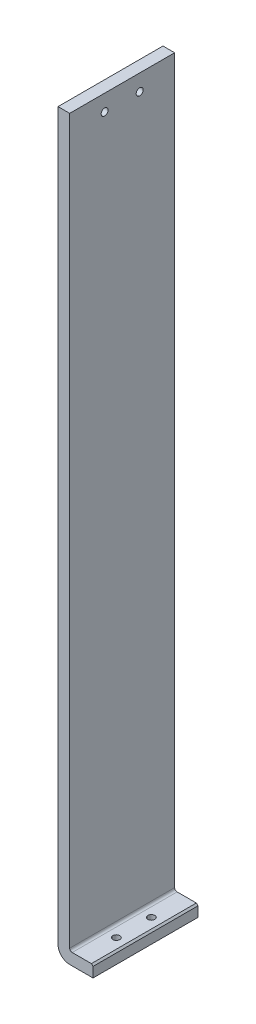
ISO-10303-21;
HEADER;
FILE_DESCRIPTION(('STEP AP214'),'2;1');
FILE_NAME('part.step','',(''),(''),'','','');
FILE_SCHEMA(('AUTOMOTIVE_DESIGN { 1 0 10303 214 1 1 1 1 }'));
ENDSEC;
DATA;
#1=APPLICATION_CONTEXT('core data for automotive mechanical design processes');
#2=APPLICATION_PROTOCOL_DEFINITION('international standard','automotive_design',2000,#1);
#3=PRODUCT_CONTEXT('',#1,'mechanical');
#4=PRODUCT('Part','Part','',(#3));
#5=PRODUCT_RELATED_PRODUCT_CATEGORY('part','',(#4));
#6=PRODUCT_DEFINITION_FORMATION('','',#4);
#7=PRODUCT_DEFINITION_CONTEXT('part definition',#1,'design');
#8=PRODUCT_DEFINITION('design','',#6,#7);
#9=PRODUCT_DEFINITION_SHAPE('','',#8);
#10=(LENGTH_UNIT() NAMED_UNIT(*) SI_UNIT(.MILLI.,.METRE.));
#11=(NAMED_UNIT(*) PLANE_ANGLE_UNIT() SI_UNIT($,.RADIAN.));
#12=(NAMED_UNIT(*) SI_UNIT($,.STERADIAN.) SOLID_ANGLE_UNIT());
#13=UNCERTAINTY_MEASURE_WITH_UNIT(LENGTH_MEASURE(1.E-05),#10,'distance_accuracy_value','');
#14=(GEOMETRIC_REPRESENTATION_CONTEXT(3) GLOBAL_UNCERTAINTY_ASSIGNED_CONTEXT((#13)) GLOBAL_UNIT_ASSIGNED_CONTEXT((#10,
#11,#12)) REPRESENTATION_CONTEXT('',''));
#15=CARTESIAN_POINT('',(0.,0.,0.));
#16=DIRECTION('',(0.,0.,1.));
#17=DIRECTION('',(1.,0.,0.));
#18=AXIS2_PLACEMENT_3D('',#15,#16,#17);
#19=CARTESIAN_POINT('',(2.49999999999952,-157.499999999971,45.));
#20=DIRECTION('',(-1.,0.,0.));
#21=DIRECTION('',(0.,-1.,0.));
#22=AXIS2_PLACEMENT_3D('',#19,#20,#21);
#23=PLANE('',#22);
#24=CARTESIAN_POINT('',(2.49999999999952,145.500000000029,15.));
#25=DIRECTION('',(-1.,0.,0.));
#26=DIRECTION('',(0.,-1.,0.));
#27=AXIS2_PLACEMENT_3D('',#24,#25,#26);
#28=CIRCLE('',#27,1.5);
#29=CARTESIAN_POINT('',(2.49999999999953,145.500000000029,16.5));
#30=VERTEX_POINT('',#29);
#31=EDGE_CURVE('E147',#30,#30,#28,.F.);
#32=ORIENTED_EDGE('',*,*,#31,.F.);
#33=EDGE_LOOP('',(#32));
#34=FACE_BOUND('',#33,.T.);
#35=CARTESIAN_POINT('',(2.49999999999952,145.500000000029,30.));
#36=DIRECTION('',(-1.,0.,0.));
#37=DIRECTION('',(0.,-1.,0.));
#38=AXIS2_PLACEMENT_3D('',#35,#36,#37);
#39=CIRCLE('',#38,1.5);
#40=CARTESIAN_POINT('',(2.49999999999953,145.500000000029,31.5));
#41=VERTEX_POINT('',#40);
#42=EDGE_CURVE('E144',#41,#41,#39,.F.);
#43=ORIENTED_EDGE('',*,*,#42,.F.);
#44=EDGE_LOOP('',(#43));
#45=FACE_BOUND('',#44,.T.);
#46=DIRECTION('',(0.,1.,0.));
#47=VECTOR('',#46,1.);
#48=CARTESIAN_POINT('',(2.49999999999952,-157.499999999971,0.));
#49=LINE('',#48,#47);
#50=CARTESIAN_POINT('',(2.49999999999952,-157.499999999971,0.));
#51=VERTEX_POINT('',#50);
#52=CARTESIAN_POINT('',(2.49999999999952,152.500000000029,0.));
#53=VERTEX_POINT('',#52);
#54=EDGE_CURVE('E132',#51,#53,#49,.T.);
#55=ORIENTED_EDGE('',*,*,#54,.T.);
#56=DIRECTION('',(0.,0.,-1.));
#57=VECTOR('',#56,1.);
#58=CARTESIAN_POINT('',(2.49999999999952,152.500000000029,45.));
#59=LINE('',#58,#57);
#60=CARTESIAN_POINT('',(2.49999999999952,152.500000000029,45.));
#61=VERTEX_POINT('',#60);
#62=EDGE_CURVE('E113',#61,#53,#59,.T.);
#63=ORIENTED_EDGE('',*,*,#62,.F.);
#64=DIRECTION('',(0.,1.,0.));
#65=VECTOR('',#64,1.);
#66=CARTESIAN_POINT('',(2.49999999999952,-157.499999999971,45.));
#67=LINE('',#66,#65);
#68=CARTESIAN_POINT('',(2.49999999999952,-157.499999999971,45.));
#69=VERTEX_POINT('',#68);
#70=EDGE_CURVE('E120',#69,#61,#67,.T.);
#71=ORIENTED_EDGE('',*,*,#70,.F.);
#72=DIRECTION('',(0.,0.,-1.));
#73=VECTOR('',#72,1.);
#74=CARTESIAN_POINT('',(2.49999999999952,-157.499999999971,45.));
#75=LINE('',#74,#73);
#76=EDGE_CURVE('E180',#69,#51,#75,.T.);
#77=ORIENTED_EDGE('',*,*,#76,.T.);
#78=EDGE_LOOP('',(#55,#63,#71,#77));
#79=FACE_BOUND('',#78,.T.);
#80=ADVANCED_FACE('F37',(#34,#45,#79),#23,.F.);
#81=CARTESIAN_POINT('',(-2.50000000000049,152.500000000029,45.));
#82=DIRECTION('',(0.,-1.,0.));
#83=DIRECTION('',(0.,0.,-1.));
#84=AXIS2_PLACEMENT_3D('',#81,#82,#83);
#85=PLANE('',#84);
#86=DIRECTION('',(-1.,0.,0.));
#87=VECTOR('',#86,1.);
#88=CARTESIAN_POINT('',(-2.50000000000049,152.500000000029,0.));
#89=LINE('',#88,#87);
#90=CARTESIAN_POINT('',(-2.50000000000049,152.500000000029,0.));
#91=VERTEX_POINT('',#90);
#92=EDGE_CURVE('E182',#53,#91,#89,.T.);
#93=ORIENTED_EDGE('',*,*,#92,.T.);
#94=DIRECTION('',(0.,0.,-1.));
#95=VECTOR('',#94,1.);
#96=CARTESIAN_POINT('',(-2.50000000000049,152.500000000029,45.));
#97=LINE('',#96,#95);
#98=CARTESIAN_POINT('',(-2.50000000000049,152.500000000029,45.));
#99=VERTEX_POINT('',#98);
#100=EDGE_CURVE('E116',#99,#91,#97,.T.);
#101=ORIENTED_EDGE('',*,*,#100,.F.);
#102=DIRECTION('',(-1.,0.,0.));
#103=VECTOR('',#102,1.);
#104=CARTESIAN_POINT('',(-2.50000000000049,152.500000000029,45.));
#105=LINE('',#104,#103);
#106=EDGE_CURVE('E109',#61,#99,#105,.T.);
#107=ORIENTED_EDGE('',*,*,#106,.F.);
#108=ORIENTED_EDGE('',*,*,#62,.T.);
#109=EDGE_LOOP('',(#93,#101,#107,#108));
#110=FACE_BOUND('',#109,.T.);
#111=ADVANCED_FACE('F111',(#110),#85,.F.);
#112=CARTESIAN_POINT('',(-2.50000000000049,-158.56066017175,45.));
#113=DIRECTION('',(1.,0.,0.));
#114=DIRECTION('',(0.,1.,0.));
#115=AXIS2_PLACEMENT_3D('',#112,#113,#114);
#116=PLANE('',#115);
#117=CARTESIAN_POINT('',(-2.50000000000049,145.500000000029,15.));
#118=DIRECTION('',(1.,0.,0.));
#119=DIRECTION('',(0.,1.,0.));
#120=AXIS2_PLACEMENT_3D('',#117,#118,#119);
#121=CIRCLE('',#120,1.5);
#122=CARTESIAN_POINT('',(-2.50000000000049,145.500000000029,16.5));
#123=VERTEX_POINT('',#122);
#124=EDGE_CURVE('E145',#123,#123,#121,.F.);
#125=ORIENTED_EDGE('',*,*,#124,.F.);
#126=EDGE_LOOP('',(#125));
#127=FACE_BOUND('',#126,.T.);
#128=CARTESIAN_POINT('',(-2.50000000000049,145.500000000029,30.));
#129=DIRECTION('',(1.,0.,0.));
#130=DIRECTION('',(0.,1.,0.));
#131=AXIS2_PLACEMENT_3D('',#128,#129,#130);
#132=CIRCLE('',#131,1.5);
#133=CARTESIAN_POINT('',(-2.50000000000049,145.500000000029,31.5));
#134=VERTEX_POINT('',#133);
#135=EDGE_CURVE('E141',#134,#134,#132,.F.);
#136=ORIENTED_EDGE('',*,*,#135,.F.);
#137=EDGE_LOOP('',(#136));
#138=FACE_BOUND('',#137,.T.);
#139=DIRECTION('',(0.,-1.,0.));
#140=VECTOR('',#139,1.);
#141=CARTESIAN_POINT('',(-2.50000000000049,-158.56066017175,0.));
#142=LINE('',#141,#140);
#143=CARTESIAN_POINT('',(-2.50000000000049,-158.56066017175,0.));
#144=VERTEX_POINT('',#143);
#145=EDGE_CURVE('E184',#91,#144,#142,.T.);
#146=ORIENTED_EDGE('',*,*,#145,.T.);
#147=DIRECTION('',(0.,0.,-1.));
#148=VECTOR('',#147,1.);
#149=CARTESIAN_POINT('',(-2.50000000000049,-158.56066017175,45.));
#150=LINE('',#149,#148);
#151=CARTESIAN_POINT('',(-2.50000000000049,-158.56066017175,45.));
#152=VERTEX_POINT('',#151);
#153=EDGE_CURVE('E137',#152,#144,#150,.T.);
#154=ORIENTED_EDGE('',*,*,#153,.F.);
#155=DIRECTION('',(0.,-1.,0.));
#156=VECTOR('',#155,1.);
#157=CARTESIAN_POINT('',(-2.50000000000049,-158.56066017175,45.));
#158=LINE('',#157,#156);
#159=EDGE_CURVE('E119',#99,#152,#158,.T.);
#160=ORIENTED_EDGE('',*,*,#159,.F.);
#161=ORIENTED_EDGE('',*,*,#100,.T.);
#162=EDGE_LOOP('',(#146,#154,#160,#161));
#163=FACE_BOUND('',#162,.T.);
#164=ADVANCED_FACE('F245',(#127,#138,#163),#116,.F.);
#165=CARTESIAN_POINT('',(2.49999999999952,-158.56066017175,45.));
#166=DIRECTION('',(0.,0.,-1.));
#167=DIRECTION('',(-1.,0.,0.));
#168=AXIS2_PLACEMENT_3D('',#165,#166,#167);
#169=CYLINDRICAL_SURFACE('',#168,5.00000000000001);
#170=CARTESIAN_POINT('',(2.49999999999952,-158.56066017175,0.));
#171=DIRECTION('',(0.,0.,1.));
#172=DIRECTION('',(1.,0.,0.));
#173=AXIS2_PLACEMENT_3D('',#170,#171,#172);
#174=CIRCLE('',#173,5.00000000000001);
#175=CARTESIAN_POINT('',(2.49999999999951,-163.56066017175,0.));
#176=VERTEX_POINT('',#175);
#177=EDGE_CURVE('E186',#144,#176,#174,.T.);
#178=ORIENTED_EDGE('',*,*,#177,.T.);
#179=DIRECTION('',(0.,0.,-1.));
#180=VECTOR('',#179,1.);
#181=CARTESIAN_POINT('',(2.49999999999951,-163.56066017175,45.));
#182=LINE('',#181,#180);
#183=CARTESIAN_POINT('',(2.49999999999951,-163.56066017175,45.));
#184=VERTEX_POINT('',#183);
#185=EDGE_CURVE('E202',#184,#176,#182,.T.);
#186=ORIENTED_EDGE('',*,*,#185,.F.);
#187=CARTESIAN_POINT('',(2.49999999999952,-158.56066017175,45.));
#188=DIRECTION('',(0.,0.,1.));
#189=DIRECTION('',(1.,0.,0.));
#190=AXIS2_PLACEMENT_3D('',#187,#188,#189);
#191=CIRCLE('',#190,5.00000000000001);
#192=EDGE_CURVE('E171',#152,#184,#191,.T.);
#193=ORIENTED_EDGE('',*,*,#192,.F.);
#194=ORIENTED_EDGE('',*,*,#153,.T.);
#195=EDGE_LOOP('',(#178,#186,#193,#194));
#196=FACE_BOUND('',#195,.T.);
#197=ADVANCED_FACE('F209',(#196),#169,.T.);
#198=CARTESIAN_POINT('',(2.49999999999951,-163.56066017175,45.));
#199=DIRECTION('',(0.,1.,0.));
#200=DIRECTION('',(0.,0.,1.));
#201=AXIS2_PLACEMENT_3D('',#198,#199,#200);
#202=PLANE('',#201);
#203=CARTESIAN_POINT('',(7.49999999999952,-163.56066017175,15.));
#204=DIRECTION('',(0.,1.,0.));
#205=DIRECTION('',(0.,0.,1.));
#206=AXIS2_PLACEMENT_3D('',#203,#204,#205);
#207=CIRCLE('',#206,1.5);
#208=CARTESIAN_POINT('',(7.49999999999952,-163.56066017175,16.5));
#209=VERTEX_POINT('',#208);
#210=EDGE_CURVE('E167',#209,#209,#207,.F.);
#211=ORIENTED_EDGE('',*,*,#210,.F.);
#212=EDGE_LOOP('',(#211));
#213=FACE_BOUND('',#212,.T.);
#214=CARTESIAN_POINT('',(7.49999999999953,-163.56066017175,30.));
#215=DIRECTION('',(0.,1.,0.));
#216=DIRECTION('',(0.,0.,1.));
#217=AXIS2_PLACEMENT_3D('',#214,#215,#216);
#218=CIRCLE('',#217,1.5);
#219=CARTESIAN_POINT('',(7.49999999999953,-163.56066017175,31.5));
#220=VERTEX_POINT('',#219);
#221=EDGE_CURVE('E162',#220,#220,#218,.F.);
#222=ORIENTED_EDGE('',*,*,#221,.F.);
#223=EDGE_LOOP('',(#222));
#224=FACE_BOUND('',#223,.T.);
#225=DIRECTION('',(1.,0.,0.));
#226=VECTOR('',#225,1.);
#227=CARTESIAN_POINT('',(2.49999999999951,-163.56066017175,0.));
#228=LINE('',#227,#226);
#229=CARTESIAN_POINT('',(12.4999999999995,-163.56066017175,0.));
#230=VERTEX_POINT('',#229);
#231=EDGE_CURVE('E188',#176,#230,#228,.T.);
#232=ORIENTED_EDGE('',*,*,#231,.T.);
#233=DIRECTION('',(0.,0.,-1.));
#234=VECTOR('',#233,1.);
#235=CARTESIAN_POINT('',(12.4999999999995,-163.56066017175,45.));
#236=LINE('',#235,#234);
#237=CARTESIAN_POINT('',(12.4999999999995,-163.56066017175,45.));
#238=VERTEX_POINT('',#237);
#239=EDGE_CURVE('E199',#238,#230,#236,.T.);
#240=ORIENTED_EDGE('',*,*,#239,.F.);
#241=DIRECTION('',(1.,0.,0.));
#242=VECTOR('',#241,1.);
#243=CARTESIAN_POINT('',(2.49999999999951,-163.56066017175,45.));
#244=LINE('',#243,#242);
#245=EDGE_CURVE('E173',#184,#238,#244,.T.);
#246=ORIENTED_EDGE('',*,*,#245,.F.);
#247=ORIENTED_EDGE('',*,*,#185,.T.);
#248=EDGE_LOOP('',(#232,#240,#246,#247));
#249=FACE_BOUND('',#248,.T.);
#250=ADVANCED_FACE('F217',(#213,#224,#249),#202,.F.);
#251=CARTESIAN_POINT('',(12.4999999999995,-163.56066017175,45.));
#252=DIRECTION('',(-1.,0.,0.));
#253=DIRECTION('',(0.,0.,1.));
#254=AXIS2_PLACEMENT_3D('',#251,#252,#253);
#255=PLANE('',#254);
#256=DIRECTION('',(0.,1.,0.));
#257=VECTOR('',#256,1.);
#258=CARTESIAN_POINT('',(12.4999999999995,-163.56066017175,0.));
#259=LINE('',#258,#257);
#260=CARTESIAN_POINT('',(12.4999999999995,-159.26066017175,0.));
#261=VERTEX_POINT('',#260);
#262=EDGE_CURVE('E190',#230,#261,#259,.T.);
#263=ORIENTED_EDGE('',*,*,#262,.T.);
#264=DIRECTION('',(0.,0.,1.));
#265=VECTOR('',#264,1.);
#266=CARTESIAN_POINT('',(12.4999999999995,-159.26066017175,45.));
#267=LINE('',#266,#265);
#268=CARTESIAN_POINT('',(12.4999999999995,-159.26066017175,45.));
#269=VERTEX_POINT('',#268);
#270=EDGE_CURVE('E46',#261,#269,#267,.T.);
#271=ORIENTED_EDGE('',*,*,#270,.T.);
#272=DIRECTION('',(0.,1.,0.));
#273=VECTOR('',#272,1.);
#274=CARTESIAN_POINT('',(12.4999999999995,-163.56066017175,45.));
#275=LINE('',#274,#273);
#276=EDGE_CURVE('E175',#238,#269,#275,.T.);
#277=ORIENTED_EDGE('',*,*,#276,.F.);
#278=ORIENTED_EDGE('',*,*,#239,.T.);
#279=EDGE_LOOP('',(#263,#271,#277,#278));
#280=FACE_BOUND('',#279,.T.);
#281=ADVANCED_FACE('F219',(#280),#255,.F.);
#282=CARTESIAN_POINT('',(12.4999999999995,-158.56066017175,45.));
#283=DIRECTION('',(0.,-1.,0.));
#284=DIRECTION('',(0.,0.,-1.));
#285=AXIS2_PLACEMENT_3D('',#282,#283,#284);
#286=PLANE('',#285);
#287=CARTESIAN_POINT('',(7.49999999999952,-158.56066017175,15.));
#288=DIRECTION('',(0.,-1.,0.));
#289=DIRECTION('',(0.,0.,-1.));
#290=AXIS2_PLACEMENT_3D('',#287,#288,#289);
#291=CIRCLE('',#290,1.5);
#292=CARTESIAN_POINT('',(7.49999999999952,-158.56066017175,16.5));
#293=VERTEX_POINT('',#292);
#294=EDGE_CURVE('E159',#293,#293,#291,.T.);
#295=ORIENTED_EDGE('',*,*,#294,.T.);
#296=EDGE_LOOP('',(#295));
#297=FACE_BOUND('',#296,.T.);
#298=CARTESIAN_POINT('',(7.49999999999953,-158.56066017175,30.));
#299=DIRECTION('',(0.,-1.,0.));
#300=DIRECTION('',(0.,0.,-1.));
#301=AXIS2_PLACEMENT_3D('',#298,#299,#300);
#302=CIRCLE('',#301,1.5);
#303=CARTESIAN_POINT('',(7.49999999999953,-158.56066017175,31.5));
#304=VERTEX_POINT('',#303);
#305=EDGE_CURVE('E152',#304,#304,#302,.T.);
#306=ORIENTED_EDGE('',*,*,#305,.T.);
#307=EDGE_LOOP('',(#306));
#308=FACE_BOUND('',#307,.T.);
#309=DIRECTION('',(-1.,0.,0.));
#310=VECTOR('',#309,1.);
#311=CARTESIAN_POINT('',(12.4999999999995,-158.56066017175,45.));
#312=LINE('',#311,#310);
#313=CARTESIAN_POINT('',(11.7999999999995,-158.56066017175,45.));
#314=VERTEX_POINT('',#313);
#315=CARTESIAN_POINT('',(3.56066017177935,-158.56066017175,45.));
#316=VERTEX_POINT('',#315);
#317=EDGE_CURVE('E177',#314,#316,#312,.T.);
#318=ORIENTED_EDGE('',*,*,#317,.F.);
#319=DIRECTION('',(0.,0.,-1.));
#320=VECTOR('',#319,1.);
#321=CARTESIAN_POINT('',(11.7999999999995,-158.56066017175,45.));
#322=LINE('',#321,#320);
#323=CARTESIAN_POINT('',(11.7999999999995,-158.56066017175,0.));
#324=VERTEX_POINT('',#323);
#325=EDGE_CURVE('E133',#314,#324,#322,.T.);
#326=ORIENTED_EDGE('',*,*,#325,.T.);
#327=DIRECTION('',(-1.,0.,0.));
#328=VECTOR('',#327,1.);
#329=CARTESIAN_POINT('',(12.4999999999995,-158.56066017175,0.));
#330=LINE('',#329,#328);
#331=CARTESIAN_POINT('',(3.56066017177935,-158.56066017175,0.));
#332=VERTEX_POINT('',#331);
#333=EDGE_CURVE('E192',#324,#332,#330,.T.);
#334=ORIENTED_EDGE('',*,*,#333,.T.);
#335=DIRECTION('',(0.,0.,-1.));
#336=VECTOR('',#335,1.);
#337=CARTESIAN_POINT('',(3.56066017177935,-158.56066017175,45.));
#338=LINE('',#337,#336);
#339=EDGE_CURVE('E196',#316,#332,#338,.T.);
#340=ORIENTED_EDGE('',*,*,#339,.F.);
#341=EDGE_LOOP('',(#318,#326,#334,#340));
#342=FACE_BOUND('',#341,.T.);
#343=ADVANCED_FACE('F225',(#297,#308,#342),#286,.F.);
#344=CARTESIAN_POINT('',(3.56066017177935,-157.499999999971,45.));
#345=DIRECTION('',(0.,0.,-1.));
#346=DIRECTION('',(-1.,0.,0.));
#347=AXIS2_PLACEMENT_3D('',#344,#345,#346);
#348=CYLINDRICAL_SURFACE('',#347,1.06066017177983);
#349=CARTESIAN_POINT('',(3.56066017177935,-157.499999999971,0.));
#350=DIRECTION('',(0.,0.,-1.));
#351=DIRECTION('',(1.,0.,0.));
#352=AXIS2_PLACEMENT_3D('',#349,#350,#351);
#353=CIRCLE('',#352,1.06066017177983);
#354=EDGE_CURVE('E129',#332,#51,#353,.T.);
#355=ORIENTED_EDGE('',*,*,#354,.T.);
#356=ORIENTED_EDGE('',*,*,#76,.F.);
#357=CARTESIAN_POINT('',(3.56066017177935,-157.499999999971,45.));
#358=DIRECTION('',(0.,0.,-1.));
#359=DIRECTION('',(1.,0.,0.));
#360=AXIS2_PLACEMENT_3D('',#357,#358,#359);
#361=CIRCLE('',#360,1.06066017177983);
#362=EDGE_CURVE('E125',#316,#69,#361,.T.);
#363=ORIENTED_EDGE('',*,*,#362,.F.);
#364=ORIENTED_EDGE('',*,*,#339,.T.);
#365=EDGE_LOOP('',(#355,#356,#363,#364));
#366=FACE_BOUND('',#365,.T.);
#367=ADVANCED_FACE('F229',(#366),#348,.F.);
#368=CARTESIAN_POINT('',(2.49999999999952,-158.56066017175,45.));
#369=DIRECTION('',(0.,0.,1.));
#370=DIRECTION('',(1.,0.,0.));
#371=AXIS2_PLACEMENT_3D('',#368,#369,#370);
#372=PLANE('',#371);
#373=ORIENTED_EDGE('',*,*,#276,.T.);
#374=DIRECTION('',(0.707106781186534,-0.707106781186562,0.));
#375=VECTOR('',#374,1.);
#376=CARTESIAN_POINT('',(7.14999999999972,-153.91066017175,45.));
#377=LINE('',#376,#375);
#378=EDGE_CURVE('E11',#269,#314,#377,.F.);
#379=ORIENTED_EDGE('',*,*,#378,.T.);
#380=ORIENTED_EDGE('',*,*,#317,.T.);
#381=ORIENTED_EDGE('',*,*,#362,.T.);
#382=ORIENTED_EDGE('',*,*,#70,.T.);
#383=ORIENTED_EDGE('',*,*,#106,.T.);
#384=ORIENTED_EDGE('',*,*,#159,.T.);
#385=ORIENTED_EDGE('',*,*,#192,.T.);
#386=ORIENTED_EDGE('',*,*,#245,.T.);
#387=EDGE_LOOP('',(#373,#379,#380,#381,#382,#383,#384,#385,#386));
#388=FACE_BOUND('',#387,.T.);
#389=ADVANCED_FACE('F123',(#388),#372,.T.);
#390=CARTESIAN_POINT('',(2.49999999999952,-158.56066017175,0.));
#391=DIRECTION('',(0.,0.,1.));
#392=DIRECTION('',(1.,0.,0.));
#393=AXIS2_PLACEMENT_3D('',#390,#391,#392);
#394=PLANE('',#393);
#395=ORIENTED_EDGE('',*,*,#333,.F.);
#396=DIRECTION('',(-0.707106781186534,0.707106781186562,0.));
#397=VECTOR('',#396,1.);
#398=CARTESIAN_POINT('',(11.7999999999995,-158.56066017175,0.));
#399=LINE('',#398,#397);
#400=EDGE_CURVE('E60',#324,#261,#399,.F.);
#401=ORIENTED_EDGE('',*,*,#400,.T.);
#402=ORIENTED_EDGE('',*,*,#262,.F.);
#403=ORIENTED_EDGE('',*,*,#231,.F.);
#404=ORIENTED_EDGE('',*,*,#177,.F.);
#405=ORIENTED_EDGE('',*,*,#145,.F.);
#406=ORIENTED_EDGE('',*,*,#92,.F.);
#407=ORIENTED_EDGE('',*,*,#54,.F.);
#408=ORIENTED_EDGE('',*,*,#354,.F.);
#409=EDGE_LOOP('',(#395,#401,#402,#403,#404,#405,#406,#407,#408));
#410=FACE_BOUND('',#409,.T.);
#411=ADVANCED_FACE('F214',(#410),#394,.F.);
#412=CARTESIAN_POINT('',(7.49999999999953,-168.56066017175,30.));
#413=DIRECTION('',(0.,1.,0.));
#414=DIRECTION('',(0.,0.,1.));
#415=AXIS2_PLACEMENT_3D('',#412,#413,#414);
#416=CYLINDRICAL_SURFACE('',#415,1.5);
#417=CARTESIAN_POINT('',(7.49999999999953,-158.56066017175,31.5));
#418=CARTESIAN_POINT('',(7.49999999999953,-158.612743505084,31.5));
#419=CARTESIAN_POINT('',(7.49999999999953,-158.664826838417,31.5));
#420=CARTESIAN_POINT('',(7.49999999999953,-158.768993505084,31.5));
#421=CARTESIAN_POINT('',(7.49999999999953,-158.821076838417,31.5));
#422=CARTESIAN_POINT('',(7.49999999999953,-158.925243505084,31.5));
#423=CARTESIAN_POINT('',(7.49999999999953,-158.977326838417,31.5));
#424=CARTESIAN_POINT('',(7.49999999999953,-159.081493505084,31.5));
#425=CARTESIAN_POINT('',(7.49999999999953,-159.133576838417,31.5));
#426=CARTESIAN_POINT('',(7.49999999999953,-159.237743505084,31.5));
#427=CARTESIAN_POINT('',(7.49999999999953,-159.289826838417,31.5));
#428=CARTESIAN_POINT('',(7.49999999999953,-159.393993505084,31.5));
#429=CARTESIAN_POINT('',(7.49999999999953,-159.446076838417,31.5));
#430=CARTESIAN_POINT('',(7.49999999999953,-159.550243505084,31.5));
#431=CARTESIAN_POINT('',(7.49999999999953,-159.602326838417,31.5));
#432=CARTESIAN_POINT('',(7.49999999999953,-159.706493505084,31.5));
#433=CARTESIAN_POINT('',(7.49999999999953,-159.758576838417,31.5));
#434=CARTESIAN_POINT('',(7.49999999999953,-159.862743505084,31.5));
#435=CARTESIAN_POINT('',(7.49999999999953,-159.914826838417,31.5));
#436=CARTESIAN_POINT('',(7.49999999999953,-160.018993505084,31.5));
#437=CARTESIAN_POINT('',(7.49999999999953,-160.071076838417,31.5));
#438=CARTESIAN_POINT('',(7.49999999999953,-160.175243505084,31.5));
#439=CARTESIAN_POINT('',(7.49999999999953,-160.227326838417,31.5));
#440=CARTESIAN_POINT('',(7.49999999999953,-160.331493505084,31.5));
#441=CARTESIAN_POINT('',(7.49999999999953,-160.383576838417,31.5));
#442=CARTESIAN_POINT('',(7.49999999999953,-160.487743505084,31.5));
#443=CARTESIAN_POINT('',(7.49999999999953,-160.539826838417,31.5));
#444=CARTESIAN_POINT('',(7.49999999999953,-160.643993505084,31.5));
#445=CARTESIAN_POINT('',(7.49999999999953,-160.696076838417,31.5));
#446=CARTESIAN_POINT('',(7.49999999999953,-160.800243505084,31.5));
#447=CARTESIAN_POINT('',(7.49999999999953,-160.852326838417,31.5));
#448=CARTESIAN_POINT('',(7.49999999999953,-160.956493505084,31.5));
#449=CARTESIAN_POINT('',(7.49999999999953,-161.008576838417,31.5));
#450=CARTESIAN_POINT('',(7.49999999999953,-161.112743505084,31.5));
#451=CARTESIAN_POINT('',(7.49999999999953,-161.164826838417,31.5));
#452=CARTESIAN_POINT('',(7.49999999999953,-161.268993505084,31.5));
#453=CARTESIAN_POINT('',(7.49999999999953,-161.321076838417,31.5));
#454=CARTESIAN_POINT('',(7.49999999999953,-161.425243505084,31.5));
#455=CARTESIAN_POINT('',(7.49999999999953,-161.477326838417,31.5));
#456=CARTESIAN_POINT('',(7.49999999999953,-161.581493505084,31.5));
#457=CARTESIAN_POINT('',(7.49999999999953,-161.633576838417,31.5));
#458=CARTESIAN_POINT('',(7.49999999999953,-161.737743505084,31.5));
#459=CARTESIAN_POINT('',(7.49999999999953,-161.789826838417,31.5));
#460=CARTESIAN_POINT('',(7.49999999999953,-161.893993505084,31.5));
#461=CARTESIAN_POINT('',(7.49999999999953,-161.946076838417,31.5));
#462=CARTESIAN_POINT('',(7.49999999999953,-162.050243505084,31.5));
#463=CARTESIAN_POINT('',(7.49999999999953,-162.102326838417,31.5));
#464=CARTESIAN_POINT('',(7.49999999999953,-162.206493505084,31.5));
#465=CARTESIAN_POINT('',(7.49999999999953,-162.258576838417,31.5));
#466=CARTESIAN_POINT('',(7.49999999999953,-162.362743505084,31.5));
#467=CARTESIAN_POINT('',(7.49999999999953,-162.414826838417,31.5));
#468=CARTESIAN_POINT('',(7.49999999999953,-162.518993505084,31.5));
#469=CARTESIAN_POINT('',(7.49999999999953,-162.571076838417,31.5));
#470=CARTESIAN_POINT('',(7.49999999999953,-162.675243505084,31.5));
#471=CARTESIAN_POINT('',(7.49999999999953,-162.727326838417,31.5));
#472=CARTESIAN_POINT('',(7.49999999999953,-162.831493505084,31.5));
#473=CARTESIAN_POINT('',(7.49999999999953,-162.883576838417,31.5));
#474=CARTESIAN_POINT('',(7.49999999999953,-162.987743505084,31.5));
#475=CARTESIAN_POINT('',(7.49999999999953,-163.039826838417,31.5));
#476=CARTESIAN_POINT('',(7.49999999999953,-163.143993505084,31.5));
#477=CARTESIAN_POINT('',(7.49999999999953,-163.196076838417,31.5));
#478=CARTESIAN_POINT('',(7.49999999999953,-163.300243505084,31.5));
#479=CARTESIAN_POINT('',(7.49999999999953,-163.352326838417,31.5));
#480=CARTESIAN_POINT('',(7.49999999999953,-163.456493505084,31.5));
#481=CARTESIAN_POINT('',(7.49999999999953,-163.508576838417,31.5));
#482=CARTESIAN_POINT('',(7.49999999999953,-163.56066017175,31.5));
#483=B_SPLINE_CURVE_WITH_KNOTS('',3,(#417,#418,#419,#420,#421,#422,#423,#424,#425,#426,#427,
#428,#429,#430,#431,#432,#433,#434,#435,#436,#437,#438,#439,#440,#441,#442,#443,#444,#445,#446,
#447,#448,#449,#450,#451,#452,#453,#454,#455,#456,#457,#458,#459,#460,#461,#462,#463,#464,#465,
#466,#467,#468,#469,#470,#471,#472,#473,#474,#475,#476,#477,#478,#479,#480,#481,#482),
.UNSPECIFIED.,.F.,.F.,(4,2,2,2,2,2,2,2,2,2,2,2,2,2,2,2,2,2,2,2,2,2,2,2,2,2,2,2,2,2,2,2,4),(0.,
0.156250000000024,0.312500000000021,0.468750000000018,0.625000000000014,0.781250000000011,
0.937500000000008,1.09375000000003,1.25000000000003,1.40625000000003,1.56250000000002,
1.71875000000002,1.87500000000002,2.03125000000004,2.18750000000004,2.34375000000003,
2.50000000000003,2.65625000000003,2.81250000000002,2.96875000000002,3.12500000000004,
3.28125000000004,3.43750000000004,3.59375000000003,3.75000000000003,3.90625000000003,
4.06250000000005,4.21875000000005,4.37500000000005,4.53125000000004,4.68750000000004,
4.84375000000004,5.00000000000006),.UNSPECIFIED.);
#484=EDGE_CURVE('BSEAM284',#304,#220,#483,.T.);
#485=ORIENTED_EDGE('',*,*,#305,.F.);
#486=ORIENTED_EDGE('',*,*,#221,.T.);
#487=ORIENTED_EDGE('',*,*,#484,.T.);
#488=ORIENTED_EDGE('',*,*,#484,.F.);
#489=EDGE_LOOP('',(#485,#487,#486,#488));
#490=FACE_BOUND('',#489,.T.);
#491=ADVANCED_FACE('F284',(#490),#416,.F.);
#492=CARTESIAN_POINT('',(7.49999999999952,-168.56066017175,15.));
#493=DIRECTION('',(0.,1.,0.));
#494=DIRECTION('',(0.,0.,1.));
#495=AXIS2_PLACEMENT_3D('',#492,#493,#494);
#496=CYLINDRICAL_SURFACE('',#495,1.5);
#497=CARTESIAN_POINT('',(7.49999999999952,-158.56066017175,16.5));
#498=CARTESIAN_POINT('',(7.49999999999952,-158.612743505084,16.5));
#499=CARTESIAN_POINT('',(7.49999999999952,-158.664826838417,16.5));
#500=CARTESIAN_POINT('',(7.49999999999952,-158.768993505084,16.5));
#501=CARTESIAN_POINT('',(7.49999999999952,-158.821076838417,16.5));
#502=CARTESIAN_POINT('',(7.49999999999952,-158.925243505084,16.5));
#503=CARTESIAN_POINT('',(7.49999999999952,-158.977326838417,16.5));
#504=CARTESIAN_POINT('',(7.49999999999952,-159.081493505084,16.5));
#505=CARTESIAN_POINT('',(7.49999999999952,-159.133576838417,16.5));
#506=CARTESIAN_POINT('',(7.49999999999952,-159.237743505084,16.5));
#507=CARTESIAN_POINT('',(7.49999999999952,-159.289826838417,16.5));
#508=CARTESIAN_POINT('',(7.49999999999952,-159.393993505084,16.5));
#509=CARTESIAN_POINT('',(7.49999999999952,-159.446076838417,16.5));
#510=CARTESIAN_POINT('',(7.49999999999952,-159.550243505084,16.5));
#511=CARTESIAN_POINT('',(7.49999999999952,-159.602326838417,16.5));
#512=CARTESIAN_POINT('',(7.49999999999952,-159.706493505084,16.5));
#513=CARTESIAN_POINT('',(7.49999999999952,-159.758576838417,16.5));
#514=CARTESIAN_POINT('',(7.49999999999952,-159.862743505084,16.5));
#515=CARTESIAN_POINT('',(7.49999999999952,-159.914826838417,16.5));
#516=CARTESIAN_POINT('',(7.49999999999952,-160.018993505084,16.5));
#517=CARTESIAN_POINT('',(7.49999999999952,-160.071076838417,16.5));
#518=CARTESIAN_POINT('',(7.49999999999952,-160.175243505084,16.5));
#519=CARTESIAN_POINT('',(7.49999999999952,-160.227326838417,16.5));
#520=CARTESIAN_POINT('',(7.49999999999952,-160.331493505084,16.5));
#521=CARTESIAN_POINT('',(7.49999999999952,-160.383576838417,16.5));
#522=CARTESIAN_POINT('',(7.49999999999952,-160.487743505084,16.5));
#523=CARTESIAN_POINT('',(7.49999999999952,-160.539826838417,16.5));
#524=CARTESIAN_POINT('',(7.49999999999952,-160.643993505084,16.5));
#525=CARTESIAN_POINT('',(7.49999999999952,-160.696076838417,16.5));
#526=CARTESIAN_POINT('',(7.49999999999952,-160.800243505084,16.5));
#527=CARTESIAN_POINT('',(7.49999999999952,-160.852326838417,16.5));
#528=CARTESIAN_POINT('',(7.49999999999952,-160.956493505084,16.5));
#529=CARTESIAN_POINT('',(7.49999999999952,-161.008576838417,16.5));
#530=CARTESIAN_POINT('',(7.49999999999952,-161.112743505084,16.5));
#531=CARTESIAN_POINT('',(7.49999999999952,-161.164826838417,16.5));
#532=CARTESIAN_POINT('',(7.49999999999952,-161.268993505084,16.5));
#533=CARTESIAN_POINT('',(7.49999999999952,-161.321076838417,16.5));
#534=CARTESIAN_POINT('',(7.49999999999952,-161.425243505084,16.5));
#535=CARTESIAN_POINT('',(7.49999999999952,-161.477326838417,16.5));
#536=CARTESIAN_POINT('',(7.49999999999952,-161.581493505084,16.5));
#537=CARTESIAN_POINT('',(7.49999999999952,-161.633576838417,16.5));
#538=CARTESIAN_POINT('',(7.49999999999952,-161.737743505084,16.5));
#539=CARTESIAN_POINT('',(7.49999999999952,-161.789826838417,16.5));
#540=CARTESIAN_POINT('',(7.49999999999952,-161.893993505084,16.5));
#541=CARTESIAN_POINT('',(7.49999999999952,-161.946076838417,16.5));
#542=CARTESIAN_POINT('',(7.49999999999952,-162.050243505084,16.5));
#543=CARTESIAN_POINT('',(7.49999999999952,-162.102326838417,16.5));
#544=CARTESIAN_POINT('',(7.49999999999952,-162.206493505084,16.5));
#545=CARTESIAN_POINT('',(7.49999999999952,-162.258576838417,16.5));
#546=CARTESIAN_POINT('',(7.49999999999952,-162.362743505084,16.5));
#547=CARTESIAN_POINT('',(7.49999999999952,-162.414826838417,16.5));
#548=CARTESIAN_POINT('',(7.49999999999952,-162.518993505084,16.5));
#549=CARTESIAN_POINT('',(7.49999999999952,-162.571076838417,16.5));
#550=CARTESIAN_POINT('',(7.49999999999952,-162.675243505084,16.5));
#551=CARTESIAN_POINT('',(7.49999999999952,-162.727326838417,16.5));
#552=CARTESIAN_POINT('',(7.49999999999952,-162.831493505084,16.5));
#553=CARTESIAN_POINT('',(7.49999999999952,-162.883576838417,16.5));
#554=CARTESIAN_POINT('',(7.49999999999952,-162.987743505084,16.5));
#555=CARTESIAN_POINT('',(7.49999999999952,-163.039826838417,16.5));
#556=CARTESIAN_POINT('',(7.49999999999952,-163.143993505084,16.5));
#557=CARTESIAN_POINT('',(7.49999999999952,-163.196076838417,16.5));
#558=CARTESIAN_POINT('',(7.49999999999952,-163.300243505084,16.5));
#559=CARTESIAN_POINT('',(7.49999999999952,-163.352326838417,16.5));
#560=CARTESIAN_POINT('',(7.49999999999952,-163.456493505084,16.5));
#561=CARTESIAN_POINT('',(7.49999999999952,-163.508576838417,16.5));
#562=CARTESIAN_POINT('',(7.49999999999952,-163.56066017175,16.5));
#563=B_SPLINE_CURVE_WITH_KNOTS('',3,(#497,#498,#499,#500,#501,#502,#503,#504,#505,#506,#507,
#508,#509,#510,#511,#512,#513,#514,#515,#516,#517,#518,#519,#520,#521,#522,#523,#524,#525,#526,
#527,#528,#529,#530,#531,#532,#533,#534,#535,#536,#537,#538,#539,#540,#541,#542,#543,#544,#545,
#546,#547,#548,#549,#550,#551,#552,#553,#554,#555,#556,#557,#558,#559,#560,#561,#562),
.UNSPECIFIED.,.F.,.F.,(4,2,2,2,2,2,2,2,2,2,2,2,2,2,2,2,2,2,2,2,2,2,2,2,2,2,2,2,2,2,2,2,4),(0.,
0.156250000000024,0.312500000000021,0.468750000000018,0.625000000000014,0.781250000000011,
0.937500000000008,1.09375000000003,1.25000000000003,1.40625000000003,1.56250000000002,
1.71875000000002,1.87500000000002,2.03125000000004,2.18750000000004,2.34375000000003,
2.50000000000003,2.65625000000003,2.81250000000002,2.96875000000002,3.12500000000004,
3.28125000000004,3.43750000000004,3.59375000000003,3.75000000000003,3.90625000000003,
4.06250000000005,4.21875000000005,4.37500000000005,4.53125000000004,4.68750000000004,
4.84375000000004,5.00000000000006),.UNSPECIFIED.);
#564=EDGE_CURVE('BSEAM307',#293,#209,#563,.T.);
#565=ORIENTED_EDGE('',*,*,#294,.F.);
#566=ORIENTED_EDGE('',*,*,#210,.T.);
#567=ORIENTED_EDGE('',*,*,#564,.T.);
#568=ORIENTED_EDGE('',*,*,#564,.F.);
#569=EDGE_LOOP('',(#565,#567,#566,#568));
#570=FACE_BOUND('',#569,.T.);
#571=ADVANCED_FACE('F307',(#570),#496,.F.);
#572=CARTESIAN_POINT('',(10.,145.500000000029,30.));
#573=DIRECTION('',(-1.,0.,0.));
#574=DIRECTION('',(0.,0.,1.));
#575=AXIS2_PLACEMENT_3D('',#572,#573,#574);
#576=CYLINDRICAL_SURFACE('',#575,1.5);
#577=CARTESIAN_POINT('',(-2.50000000000049,145.500000000029,31.5));
#578=CARTESIAN_POINT('',(-2.44791666666716,145.500000000029,31.5));
#579=CARTESIAN_POINT('',(-2.39583333333382,145.500000000029,31.5));
#580=CARTESIAN_POINT('',(-2.29166666666716,145.500000000029,31.5));
#581=CARTESIAN_POINT('',(-2.23958333333382,145.500000000029,31.5));
#582=CARTESIAN_POINT('',(-2.13541666666716,145.500000000029,31.5));
#583=CARTESIAN_POINT('',(-2.08333333333382,145.500000000029,31.5));
#584=CARTESIAN_POINT('',(-1.97916666666715,145.500000000029,31.5));
#585=CARTESIAN_POINT('',(-1.92708333333382,145.500000000029,31.5));
#586=CARTESIAN_POINT('',(-1.82291666666715,145.500000000029,31.5));
#587=CARTESIAN_POINT('',(-1.77083333333382,145.500000000029,31.5));
#588=CARTESIAN_POINT('',(-1.66666666666715,145.500000000029,31.5));
#589=CARTESIAN_POINT('',(-1.61458333333382,145.500000000029,31.5));
#590=CARTESIAN_POINT('',(-1.51041666666715,145.500000000029,31.5));
#591=CARTESIAN_POINT('',(-1.45833333333382,145.500000000029,31.5));
#592=CARTESIAN_POINT('',(-1.35416666666715,145.500000000029,31.5));
#593=CARTESIAN_POINT('',(-1.30208333333382,145.500000000029,31.5));
#594=CARTESIAN_POINT('',(-1.19791666666715,145.500000000029,31.5));
#595=CARTESIAN_POINT('',(-1.14583333333382,145.500000000029,31.5));
#596=CARTESIAN_POINT('',(-1.04166666666715,145.500000000029,31.5));
#597=CARTESIAN_POINT('',(-0.989583333333818,145.500000000029,31.5));
#598=CARTESIAN_POINT('',(-0.885416666667151,145.500000000029,31.5));
#599=CARTESIAN_POINT('',(-0.833333333333818,145.500000000029,31.5));
#600=CARTESIAN_POINT('',(-0.729166666667151,145.500000000029,31.5));
#601=CARTESIAN_POINT('',(-0.677083333333818,145.500000000029,31.5));
#602=CARTESIAN_POINT('',(-0.572916666667151,145.500000000029,31.5));
#603=CARTESIAN_POINT('',(-0.520833333333818,145.500000000029,31.5));
#604=CARTESIAN_POINT('',(-0.416666666667151,145.500000000029,31.5));
#605=CARTESIAN_POINT('',(-0.364583333333818,145.500000000029,31.5));
#606=CARTESIAN_POINT('',(-0.26041666666715,145.500000000029,31.5));
#607=CARTESIAN_POINT('',(-0.208333333333816,145.500000000029,31.5));
#608=CARTESIAN_POINT('',(-0.104166666667149,145.500000000029,31.5));
#609=CARTESIAN_POINT('',(-0.0520833333338156,145.500000000029,31.5));
#610=CARTESIAN_POINT('',(0.0520833333328511,145.500000000029,31.5));
#611=CARTESIAN_POINT('',(0.104166666666185,145.500000000029,31.5));
#612=CARTESIAN_POINT('',(0.208333333332852,145.500000000029,31.5));
#613=CARTESIAN_POINT('',(0.260416666666186,145.500000000029,31.5));
#614=CARTESIAN_POINT('',(0.364583333332853,145.500000000029,31.5));
#615=CARTESIAN_POINT('',(0.416666666666187,145.500000000029,31.5));
#616=CARTESIAN_POINT('',(0.520833333332853,145.500000000029,31.5));
#617=CARTESIAN_POINT('',(0.572916666666187,145.500000000029,31.5));
#618=CARTESIAN_POINT('',(0.677083333332853,145.500000000029,31.5));
#619=CARTESIAN_POINT('',(0.729166666666187,145.500000000029,31.5));
#620=CARTESIAN_POINT('',(0.833333333332854,145.500000000029,31.5));
#621=CARTESIAN_POINT('',(0.885416666666187,145.500000000029,31.5));
#622=CARTESIAN_POINT('',(0.989583333332854,145.500000000029,31.5));
#623=CARTESIAN_POINT('',(1.04166666666619,145.500000000029,31.5));
#624=CARTESIAN_POINT('',(1.14583333333285,145.500000000029,31.5));
#625=CARTESIAN_POINT('',(1.19791666666619,145.500000000029,31.5));
#626=CARTESIAN_POINT('',(1.30208333333285,145.500000000029,31.5));
#627=CARTESIAN_POINT('',(1.35416666666619,145.500000000029,31.5));
#628=CARTESIAN_POINT('',(1.45833333333285,145.500000000029,31.5));
#629=CARTESIAN_POINT('',(1.51041666666619,145.500000000029,31.5));
#630=CARTESIAN_POINT('',(1.61458333333286,145.500000000029,31.5));
#631=CARTESIAN_POINT('',(1.66666666666619,145.500000000029,31.5));
#632=CARTESIAN_POINT('',(1.77083333333286,145.500000000029,31.5));
#633=CARTESIAN_POINT('',(1.82291666666619,145.500000000029,31.5));
#634=CARTESIAN_POINT('',(1.92708333333286,145.500000000029,31.5));
#635=CARTESIAN_POINT('',(1.97916666666619,145.500000000029,31.5));
#636=CARTESIAN_POINT('',(2.08333333333286,145.500000000029,31.5));
#637=CARTESIAN_POINT('',(2.13541666666619,145.500000000029,31.5));
#638=CARTESIAN_POINT('',(2.23958333333286,145.500000000029,31.5));
#639=CARTESIAN_POINT('',(2.29166666666619,145.500000000029,31.5));
#640=CARTESIAN_POINT('',(2.39583333333286,145.500000000029,31.5));
#641=CARTESIAN_POINT('',(2.44791666666619,145.500000000029,31.5));
#642=CARTESIAN_POINT('',(2.49999999999953,145.500000000029,31.5));
#643=B_SPLINE_CURVE_WITH_KNOTS('',3,(#577,#578,#579,#580,#581,#582,#583,#584,#585,#586,#587,
#588,#589,#590,#591,#592,#593,#594,#595,#596,#597,#598,#599,#600,#601,#602,#603,#604,#605,#606,
#607,#608,#609,#610,#611,#612,#613,#614,#615,#616,#617,#618,#619,#620,#621,#622,#623,#624,#625,
#626,#627,#628,#629,#630,#631,#632,#633,#634,#635,#636,#637,#638,#639,#640,#641,#642),
.UNSPECIFIED.,.F.,.F.,(4,2,2,2,2,2,2,2,2,2,2,2,2,2,2,2,2,2,2,2,2,2,2,2,2,2,2,2,2,2,2,2,4),(0.,
0.15625,0.3125,0.468750000000002,0.625000000000002,0.781250000000002,0.937500000000003,1.09375,
1.25,1.40625,1.5625,1.71875,1.87500000000001,2.03125000000001,2.18750000000001,2.34375000000001,
2.50000000000001,2.65625000000001,2.81250000000001,2.96875000000001,3.12500000000001,
3.28125000000001,3.43750000000001,3.59375000000001,3.75000000000001,3.90625000000001,
4.06250000000001,4.21875000000001,4.37500000000001,4.53125000000001,4.68750000000001,
4.84375000000002,5.00000000000002),.UNSPECIFIED.);
#644=EDGE_CURVE('BSEAM301',#134,#41,#643,.T.);
#645=ORIENTED_EDGE('',*,*,#135,.T.);
#646=ORIENTED_EDGE('',*,*,#42,.T.);
#647=ORIENTED_EDGE('',*,*,#644,.T.);
#648=ORIENTED_EDGE('',*,*,#644,.F.);
#649=EDGE_LOOP('',(#645,#647,#646,#648));
#650=FACE_BOUND('',#649,.T.);
#651=ADVANCED_FACE('F301',(#650),#576,.F.);
#652=CARTESIAN_POINT('',(10.,145.500000000029,15.));
#653=DIRECTION('',(-1.,0.,0.));
#654=DIRECTION('',(0.,0.,1.));
#655=AXIS2_PLACEMENT_3D('',#652,#653,#654);
#656=CYLINDRICAL_SURFACE('',#655,1.5);
#657=CARTESIAN_POINT('',(-2.50000000000049,145.500000000029,16.5));
#658=CARTESIAN_POINT('',(-2.44791666666716,145.500000000029,16.5));
#659=CARTESIAN_POINT('',(-2.39583333333382,145.500000000029,16.5));
#660=CARTESIAN_POINT('',(-2.29166666666716,145.500000000029,16.5));
#661=CARTESIAN_POINT('',(-2.23958333333382,145.500000000029,16.5));
#662=CARTESIAN_POINT('',(-2.13541666666716,145.500000000029,16.5));
#663=CARTESIAN_POINT('',(-2.08333333333382,145.500000000029,16.5));
#664=CARTESIAN_POINT('',(-1.97916666666715,145.500000000029,16.5));
#665=CARTESIAN_POINT('',(-1.92708333333382,145.500000000029,16.5));
#666=CARTESIAN_POINT('',(-1.82291666666715,145.500000000029,16.5));
#667=CARTESIAN_POINT('',(-1.77083333333382,145.500000000029,16.5));
#668=CARTESIAN_POINT('',(-1.66666666666715,145.500000000029,16.5));
#669=CARTESIAN_POINT('',(-1.61458333333382,145.500000000029,16.5));
#670=CARTESIAN_POINT('',(-1.51041666666715,145.500000000029,16.5));
#671=CARTESIAN_POINT('',(-1.45833333333382,145.500000000029,16.5));
#672=CARTESIAN_POINT('',(-1.35416666666715,145.500000000029,16.5));
#673=CARTESIAN_POINT('',(-1.30208333333382,145.500000000029,16.5));
#674=CARTESIAN_POINT('',(-1.19791666666715,145.500000000029,16.5));
#675=CARTESIAN_POINT('',(-1.14583333333382,145.500000000029,16.5));
#676=CARTESIAN_POINT('',(-1.04166666666715,145.500000000029,16.5));
#677=CARTESIAN_POINT('',(-0.989583333333818,145.500000000029,16.5));
#678=CARTESIAN_POINT('',(-0.885416666667151,145.500000000029,16.5));
#679=CARTESIAN_POINT('',(-0.833333333333818,145.500000000029,16.5));
#680=CARTESIAN_POINT('',(-0.729166666667151,145.500000000029,16.5));
#681=CARTESIAN_POINT('',(-0.677083333333818,145.500000000029,16.5));
#682=CARTESIAN_POINT('',(-0.572916666667151,145.500000000029,16.5));
#683=CARTESIAN_POINT('',(-0.520833333333818,145.500000000029,16.5));
#684=CARTESIAN_POINT('',(-0.416666666667151,145.500000000029,16.5));
#685=CARTESIAN_POINT('',(-0.364583333333818,145.500000000029,16.5));
#686=CARTESIAN_POINT('',(-0.26041666666715,145.500000000029,16.5));
#687=CARTESIAN_POINT('',(-0.208333333333816,145.500000000029,16.5));
#688=CARTESIAN_POINT('',(-0.104166666667149,145.500000000029,16.5));
#689=CARTESIAN_POINT('',(-0.0520833333338156,145.500000000029,16.5));
#690=CARTESIAN_POINT('',(0.0520833333328511,145.500000000029,16.5));
#691=CARTESIAN_POINT('',(0.104166666666185,145.500000000029,16.5));
#692=CARTESIAN_POINT('',(0.208333333332852,145.500000000029,16.5));
#693=CARTESIAN_POINT('',(0.260416666666186,145.500000000029,16.5));
#694=CARTESIAN_POINT('',(0.364583333332853,145.500000000029,16.5));
#695=CARTESIAN_POINT('',(0.416666666666187,145.500000000029,16.5));
#696=CARTESIAN_POINT('',(0.520833333332853,145.500000000029,16.5));
#697=CARTESIAN_POINT('',(0.572916666666187,145.500000000029,16.5));
#698=CARTESIAN_POINT('',(0.677083333332853,145.500000000029,16.5));
#699=CARTESIAN_POINT('',(0.729166666666187,145.500000000029,16.5));
#700=CARTESIAN_POINT('',(0.833333333332854,145.500000000029,16.5));
#701=CARTESIAN_POINT('',(0.885416666666187,145.500000000029,16.5));
#702=CARTESIAN_POINT('',(0.989583333332854,145.500000000029,16.5));
#703=CARTESIAN_POINT('',(1.04166666666619,145.500000000029,16.5));
#704=CARTESIAN_POINT('',(1.14583333333285,145.500000000029,16.5));
#705=CARTESIAN_POINT('',(1.19791666666619,145.500000000029,16.5));
#706=CARTESIAN_POINT('',(1.30208333333285,145.500000000029,16.5));
#707=CARTESIAN_POINT('',(1.35416666666619,145.500000000029,16.5));
#708=CARTESIAN_POINT('',(1.45833333333285,145.500000000029,16.5));
#709=CARTESIAN_POINT('',(1.51041666666619,145.500000000029,16.5));
#710=CARTESIAN_POINT('',(1.61458333333286,145.500000000029,16.5));
#711=CARTESIAN_POINT('',(1.66666666666619,145.500000000029,16.5));
#712=CARTESIAN_POINT('',(1.77083333333286,145.500000000029,16.5));
#713=CARTESIAN_POINT('',(1.82291666666619,145.500000000029,16.5));
#714=CARTESIAN_POINT('',(1.92708333333286,145.500000000029,16.5));
#715=CARTESIAN_POINT('',(1.97916666666619,145.500000000029,16.5));
#716=CARTESIAN_POINT('',(2.08333333333286,145.500000000029,16.5));
#717=CARTESIAN_POINT('',(2.13541666666619,145.500000000029,16.5));
#718=CARTESIAN_POINT('',(2.23958333333286,145.500000000029,16.5));
#719=CARTESIAN_POINT('',(2.29166666666619,145.500000000029,16.5));
#720=CARTESIAN_POINT('',(2.39583333333286,145.500000000029,16.5));
#721=CARTESIAN_POINT('',(2.44791666666619,145.500000000029,16.5));
#722=CARTESIAN_POINT('',(2.49999999999953,145.500000000029,16.5));
#723=B_SPLINE_CURVE_WITH_KNOTS('',3,(#657,#658,#659,#660,#661,#662,#663,#664,#665,#666,#667,
#668,#669,#670,#671,#672,#673,#674,#675,#676,#677,#678,#679,#680,#681,#682,#683,#684,#685,#686,
#687,#688,#689,#690,#691,#692,#693,#694,#695,#696,#697,#698,#699,#700,#701,#702,#703,#704,#705,
#706,#707,#708,#709,#710,#711,#712,#713,#714,#715,#716,#717,#718,#719,#720,#721,#722),
.UNSPECIFIED.,.F.,.F.,(4,2,2,2,2,2,2,2,2,2,2,2,2,2,2,2,2,2,2,2,2,2,2,2,2,2,2,2,2,2,2,2,4),(0.,
0.15625,0.3125,0.468750000000002,0.625000000000002,0.781250000000002,0.937500000000003,1.09375,
1.25,1.40625,1.5625,1.71875,1.87500000000001,2.03125000000001,2.18750000000001,2.34375000000001,
2.50000000000001,2.65625000000001,2.81250000000001,2.96875000000001,3.12500000000001,
3.28125000000001,3.43750000000001,3.59375000000001,3.75000000000001,3.90625000000001,
4.06250000000001,4.21875000000001,4.37500000000001,4.53125000000001,4.68750000000001,
4.84375000000002,5.00000000000002),.UNSPECIFIED.);
#724=EDGE_CURVE('BSEAM293',#123,#30,#723,.T.);
#725=ORIENTED_EDGE('',*,*,#124,.T.);
#726=ORIENTED_EDGE('',*,*,#31,.T.);
#727=ORIENTED_EDGE('',*,*,#724,.T.);
#728=ORIENTED_EDGE('',*,*,#724,.F.);
#729=EDGE_LOOP('',(#725,#727,#726,#728));
#730=FACE_BOUND('',#729,.T.);
#731=ADVANCED_FACE('F293',(#730),#656,.F.);
#732=CARTESIAN_POINT('',(11.7999999999995,-158.56066017175,45.));
#733=DIRECTION('',(-0.707106781186562,-0.707106781186534,0.));
#734=DIRECTION('',(0.,0.,-1.));
#735=AXIS2_PLACEMENT_3D('',#732,#733,#734);
#736=PLANE('',#735);
#737=ORIENTED_EDGE('',*,*,#378,.F.);
#738=ORIENTED_EDGE('',*,*,#270,.F.);
#739=ORIENTED_EDGE('',*,*,#400,.F.);
#740=ORIENTED_EDGE('',*,*,#325,.F.);
#741=EDGE_LOOP('',(#737,#738,#739,#740));
#742=FACE_BOUND('',#741,.T.);
#743=ADVANCED_FACE('F40',(#742),#736,.F.);
#744=CLOSED_SHELL('',(#80,#111,#164,#197,#250,#281,#343,#367,#389,#411,#491,#571,#651,#731,#743));
#745=MANIFOLD_SOLID_BREP('B2',#744);
#746=ADVANCED_BREP_SHAPE_REPRESENTATION('',(#18,#745),#14);
#747=SHAPE_DEFINITION_REPRESENTATION(#9,#746);
ENDSEC;
END-ISO-10303-21;
